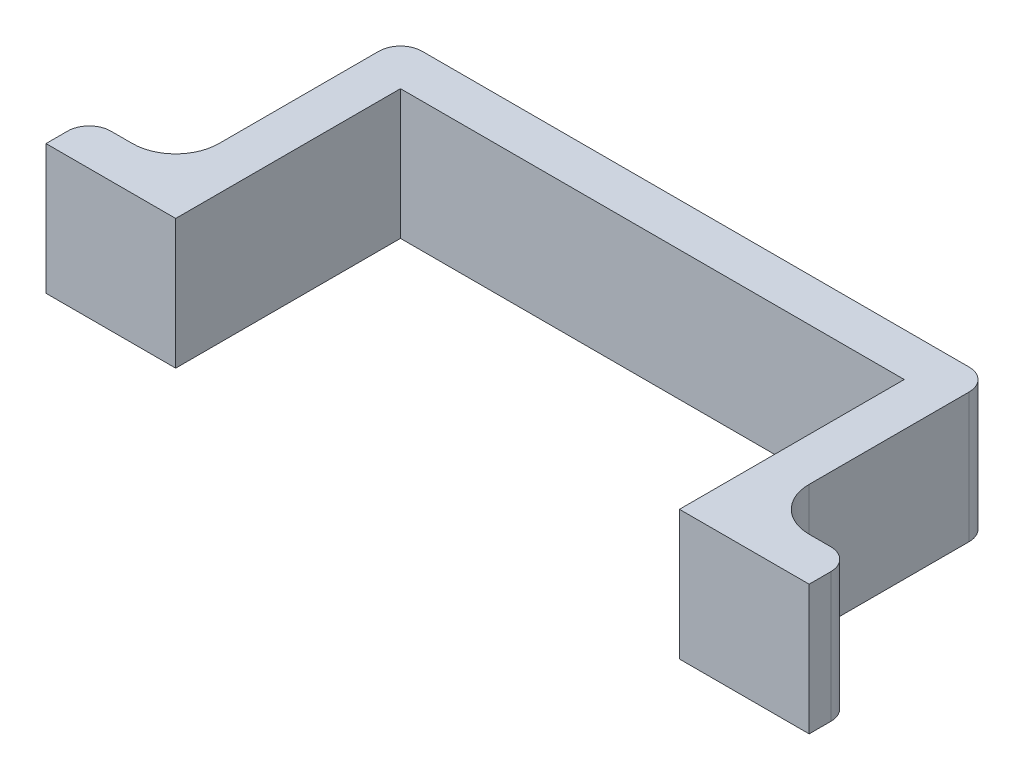
ISO-10303-21;
HEADER;
FILE_DESCRIPTION(('STEP AP214'),'2;1');
FILE_NAME('part.step','',(''),(''),'','','');
FILE_SCHEMA(('AUTOMOTIVE_DESIGN { 1 0 10303 214 1 1 1 1 }'));
ENDSEC;
DATA;
#1=APPLICATION_CONTEXT('core data for automotive mechanical design processes');
#2=APPLICATION_PROTOCOL_DEFINITION('international standard','automotive_design',2000,#1);
#3=PRODUCT_CONTEXT('',#1,'mechanical');
#4=PRODUCT('Part','Part','',(#3));
#5=PRODUCT_RELATED_PRODUCT_CATEGORY('part','',(#4));
#6=PRODUCT_DEFINITION_FORMATION('','',#4);
#7=PRODUCT_DEFINITION_CONTEXT('part definition',#1,'design');
#8=PRODUCT_DEFINITION('design','',#6,#7);
#9=PRODUCT_DEFINITION_SHAPE('','',#8);
#10=(LENGTH_UNIT() NAMED_UNIT(*) SI_UNIT(.MILLI.,.METRE.));
#11=(NAMED_UNIT(*) PLANE_ANGLE_UNIT() SI_UNIT($,.RADIAN.));
#12=(NAMED_UNIT(*) SI_UNIT($,.STERADIAN.) SOLID_ANGLE_UNIT());
#13=UNCERTAINTY_MEASURE_WITH_UNIT(LENGTH_MEASURE(1.E-05),#10,'distance_accuracy_value','');
#14=(GEOMETRIC_REPRESENTATION_CONTEXT(3) GLOBAL_UNCERTAINTY_ASSIGNED_CONTEXT((#13)) GLOBAL_UNIT_ASSIGNED_CONTEXT((#10,
#11,#12)) REPRESENTATION_CONTEXT('',''));
#15=CARTESIAN_POINT('',(0.,0.,0.));
#16=DIRECTION('',(0.,0.,1.));
#17=DIRECTION('',(1.,0.,0.));
#18=AXIS2_PLACEMENT_3D('',#15,#16,#17);
#19=CARTESIAN_POINT('',(-40.175,19.05,-3.17499999999999));
#20=DIRECTION('',(0.,-1.,0.));
#21=DIRECTION('',(0.,0.,-1.));
#22=AXIS2_PLACEMENT_3D('',#19,#20,#21);
#23=CYLINDRICAL_SURFACE('',#22,3.175);
#24=CARTESIAN_POINT('',(-40.175,0.,-3.17499999999999));
#25=DIRECTION('',(0.,1.,0.));
#26=DIRECTION('',(0.,0.,1.));
#27=AXIS2_PLACEMENT_3D('',#24,#25,#26);
#28=CIRCLE('',#27,3.175);
#29=CARTESIAN_POINT('',(-43.35,0.,-3.17499999999999));
#30=VERTEX_POINT('',#29);
#31=CARTESIAN_POINT('',(-40.175,0.,-6.35));
#32=VERTEX_POINT('',#31);
#33=EDGE_CURVE('E202',#30,#32,#28,.F.);
#34=ORIENTED_EDGE('',*,*,#33,.F.);
#35=DIRECTION('',(0.,-1.,0.));
#36=VECTOR('',#35,1.);
#37=CARTESIAN_POINT('',(-43.35,19.05,-3.17499999999999));
#38=LINE('',#37,#36);
#39=CARTESIAN_POINT('',(-43.35,19.05,-3.17499999999999));
#40=VERTEX_POINT('',#39);
#41=EDGE_CURVE('E12',#40,#30,#38,.T.);
#42=ORIENTED_EDGE('',*,*,#41,.F.);
#43=CARTESIAN_POINT('',(-40.175,19.05,-3.17499999999999));
#44=DIRECTION('',(0.,1.,0.));
#45=DIRECTION('',(0.,0.,1.));
#46=AXIS2_PLACEMENT_3D('',#43,#44,#45);
#47=CIRCLE('',#46,3.175);
#48=CARTESIAN_POINT('',(-40.175,19.05,-6.35));
#49=VERTEX_POINT('',#48);
#50=EDGE_CURVE('E265',#40,#49,#47,.F.);
#51=ORIENTED_EDGE('',*,*,#50,.T.);
#52=DIRECTION('',(0.,-1.,0.));
#53=VECTOR('',#52,1.);
#54=CARTESIAN_POINT('',(-40.175,19.05,-6.35));
#55=LINE('',#54,#53);
#56=EDGE_CURVE('E61',#49,#32,#55,.T.);
#57=ORIENTED_EDGE('',*,*,#56,.T.);
#58=EDGE_LOOP('',(#34,#42,#51,#57));
#59=FACE_BOUND('',#58,.T.);
#60=ADVANCED_FACE('F44',(#59),#23,.T.);
#61=CARTESIAN_POINT('',(-43.35,19.05,0.));
#62=DIRECTION('',(-1.,0.,0.));
#63=DIRECTION('',(0.,0.,1.));
#64=AXIS2_PLACEMENT_3D('',#61,#62,#63);
#65=PLANE('',#64);
#66=DIRECTION('',(0.,0.,-1.));
#67=VECTOR('',#66,1.);
#68=CARTESIAN_POINT('',(-43.35,0.,0.));
#69=LINE('',#68,#67);
#70=CARTESIAN_POINT('',(-43.35,0.,20.32));
#71=VERTEX_POINT('',#70);
#72=EDGE_CURVE('E205',#71,#30,#69,.T.);
#73=ORIENTED_EDGE('',*,*,#72,.F.);
#74=DIRECTION('',(0.,-1.,0.));
#75=VECTOR('',#74,1.);
#76=CARTESIAN_POINT('',(-43.35,19.05,20.32));
#77=LINE('',#76,#75);
#78=CARTESIAN_POINT('',(-43.35,19.05,20.32));
#79=VERTEX_POINT('',#78);
#80=EDGE_CURVE('E53',#79,#71,#77,.T.);
#81=ORIENTED_EDGE('',*,*,#80,.F.);
#82=DIRECTION('',(0.,0.,-1.));
#83=VECTOR('',#82,1.);
#84=CARTESIAN_POINT('',(-43.35,19.05,0.));
#85=LINE('',#84,#83);
#86=EDGE_CURVE('E328',#79,#40,#85,.T.);
#87=ORIENTED_EDGE('',*,*,#86,.T.);
#88=ORIENTED_EDGE('',*,*,#41,.T.);
#89=EDGE_LOOP('',(#73,#81,#87,#88));
#90=FACE_BOUND('',#89,.T.);
#91=ADVANCED_FACE('F327',(#90),#65,.T.);
#92=CARTESIAN_POINT('',(-49.7,19.05,20.32));
#93=DIRECTION('',(0.,-1.,0.));
#94=DIRECTION('',(0.,0.,-1.));
#95=AXIS2_PLACEMENT_3D('',#92,#93,#94);
#96=CYLINDRICAL_SURFACE('',#95,6.34999999999999);
#97=CARTESIAN_POINT('',(-49.7,0.,20.32));
#98=DIRECTION('',(0.,1.,0.));
#99=DIRECTION('',(0.,0.,1.));
#100=AXIS2_PLACEMENT_3D('',#97,#98,#99);
#101=CIRCLE('',#100,6.34999999999999);
#102=CARTESIAN_POINT('',(-49.7,0.,26.67));
#103=VERTEX_POINT('',#102);
#104=EDGE_CURVE('E209',#71,#103,#101,.F.);
#105=ORIENTED_EDGE('',*,*,#104,.T.);
#106=DIRECTION('',(0.,-1.,0.));
#107=VECTOR('',#106,1.);
#108=CARTESIAN_POINT('',(-49.7,19.05,26.67));
#109=LINE('',#108,#107);
#110=CARTESIAN_POINT('',(-49.7,19.05,26.67));
#111=VERTEX_POINT('',#110);
#112=EDGE_CURVE('E309',#111,#103,#109,.T.);
#113=ORIENTED_EDGE('',*,*,#112,.F.);
#114=CARTESIAN_POINT('',(-49.7,19.05,20.32));
#115=DIRECTION('',(0.,1.,0.));
#116=DIRECTION('',(0.,0.,1.));
#117=AXIS2_PLACEMENT_3D('',#114,#115,#116);
#118=CIRCLE('',#117,6.34999999999999);
#119=EDGE_CURVE('E318',#79,#111,#118,.F.);
#120=ORIENTED_EDGE('',*,*,#119,.F.);
#121=ORIENTED_EDGE('',*,*,#80,.T.);
#122=EDGE_LOOP('',(#105,#113,#120,#121));
#123=FACE_BOUND('',#122,.T.);
#124=ADVANCED_FACE('F316',(#123),#96,.F.);
#125=CARTESIAN_POINT('',(0.,19.05,26.67));
#126=DIRECTION('',(0.,0.,1.));
#127=DIRECTION('',(1.,0.,0.));
#128=AXIS2_PLACEMENT_3D('',#125,#126,#127);
#129=PLANE('',#128);
#130=DIRECTION('',(-1.,0.,0.));
#131=VECTOR('',#130,1.);
#132=CARTESIAN_POINT('',(0.,0.,26.67));
#133=LINE('',#132,#131);
#134=CARTESIAN_POINT('',(-52.875,0.,26.67));
#135=VERTEX_POINT('',#134);
#136=EDGE_CURVE('E212',#103,#135,#133,.T.);
#137=ORIENTED_EDGE('',*,*,#136,.T.);
#138=DIRECTION('',(0.,-1.,0.));
#139=VECTOR('',#138,1.);
#140=CARTESIAN_POINT('',(-52.875,19.05,26.67));
#141=LINE('',#140,#139);
#142=CARTESIAN_POINT('',(-52.875,19.05,26.67));
#143=VERTEX_POINT('',#142);
#144=EDGE_CURVE('E305',#143,#135,#141,.T.);
#145=ORIENTED_EDGE('',*,*,#144,.F.);
#146=DIRECTION('',(-1.,0.,0.));
#147=VECTOR('',#146,1.);
#148=CARTESIAN_POINT('',(0.,19.05,26.67));
#149=LINE('',#148,#147);
#150=EDGE_CURVE('E595',#111,#143,#149,.T.);
#151=ORIENTED_EDGE('',*,*,#150,.F.);
#152=ORIENTED_EDGE('',*,*,#112,.T.);
#153=EDGE_LOOP('',(#137,#145,#151,#152));
#154=FACE_BOUND('',#153,.T.);
#155=ADVANCED_FACE('F346',(#154),#129,.F.);
#156=CARTESIAN_POINT('',(-52.875,19.05,29.845));
#157=DIRECTION('',(0.,-1.,0.));
#158=DIRECTION('',(0.,0.,-1.));
#159=AXIS2_PLACEMENT_3D('',#156,#157,#158);
#160=CYLINDRICAL_SURFACE('',#159,3.17500000000001);
#161=CARTESIAN_POINT('',(-52.875,0.,29.845));
#162=DIRECTION('',(0.,1.,0.));
#163=DIRECTION('',(0.,0.,1.));
#164=AXIS2_PLACEMENT_3D('',#161,#162,#163);
#165=CIRCLE('',#164,3.17500000000001);
#166=CARTESIAN_POINT('',(-56.05,0.,29.845));
#167=VERTEX_POINT('',#166);
#168=EDGE_CURVE('E215',#135,#167,#165,.T.);
#169=ORIENTED_EDGE('',*,*,#168,.T.);
#170=DIRECTION('',(0.,-1.,0.));
#171=VECTOR('',#170,1.);
#172=CARTESIAN_POINT('',(-56.05,19.05,29.845));
#173=LINE('',#172,#171);
#174=CARTESIAN_POINT('',(-56.05,19.05,29.845));
#175=VERTEX_POINT('',#174);
#176=EDGE_CURVE('E302',#175,#167,#173,.T.);
#177=ORIENTED_EDGE('',*,*,#176,.F.);
#178=CARTESIAN_POINT('',(-52.875,19.05,29.845));
#179=DIRECTION('',(0.,1.,0.));
#180=DIRECTION('',(0.,0.,1.));
#181=AXIS2_PLACEMENT_3D('',#178,#179,#180);
#182=CIRCLE('',#181,3.17500000000001);
#183=EDGE_CURVE('E593',#143,#175,#182,.T.);
#184=ORIENTED_EDGE('',*,*,#183,.F.);
#185=ORIENTED_EDGE('',*,*,#144,.T.);
#186=EDGE_LOOP('',(#169,#177,#184,#185));
#187=FACE_BOUND('',#186,.T.);
#188=ADVANCED_FACE('F351',(#187),#160,.T.);
#189=CARTESIAN_POINT('',(-56.0500000000001,19.05,2.44992128071812E-13));
#190=DIRECTION('',(-1.,0.,0.));
#191=DIRECTION('',(0.,0.,1.));
#192=AXIS2_PLACEMENT_3D('',#189,#190,#191);
#193=PLANE('',#192);
#194=DIRECTION('',(0.,0.,-1.));
#195=VECTOR('',#194,1.);
#196=CARTESIAN_POINT('',(-56.0500000000001,0.,2.44992128071812E-13));
#197=LINE('',#196,#195);
#198=CARTESIAN_POINT('',(-56.05,0.,33.02));
#199=VERTEX_POINT('',#198);
#200=EDGE_CURVE('E219',#199,#167,#197,.T.);
#201=ORIENTED_EDGE('',*,*,#200,.F.);
#202=DIRECTION('',(0.,-1.,0.));
#203=VECTOR('',#202,1.);
#204=CARTESIAN_POINT('',(-56.05,19.05,33.02));
#205=LINE('',#204,#203);
#206=CARTESIAN_POINT('',(-56.05,19.05,33.02));
#207=VERTEX_POINT('',#206);
#208=EDGE_CURVE('E299',#207,#199,#205,.T.);
#209=ORIENTED_EDGE('',*,*,#208,.F.);
#210=DIRECTION('',(0.,0.,-1.));
#211=VECTOR('',#210,1.);
#212=CARTESIAN_POINT('',(-56.0500000000001,19.05,2.44992128071812E-13));
#213=LINE('',#212,#211);
#214=EDGE_CURVE('E590',#207,#175,#213,.T.);
#215=ORIENTED_EDGE('',*,*,#214,.T.);
#216=ORIENTED_EDGE('',*,*,#176,.T.);
#217=EDGE_LOOP('',(#201,#209,#215,#216));
#218=FACE_BOUND('',#217,.T.);
#219=ADVANCED_FACE('F355',(#218),#193,.T.);
#220=CARTESIAN_POINT('',(0.,19.05,33.02));
#221=DIRECTION('',(0.,0.,1.));
#222=DIRECTION('',(1.,0.,0.));
#223=AXIS2_PLACEMENT_3D('',#220,#221,#222);
#224=PLANE('',#223);
#225=DIRECTION('',(-1.,0.,0.));
#226=VECTOR('',#225,1.);
#227=CARTESIAN_POINT('',(0.,0.,33.02));
#228=LINE('',#227,#226);
#229=CARTESIAN_POINT('',(-37.,0.,33.02));
#230=VERTEX_POINT('',#229);
#231=EDGE_CURVE('E223',#230,#199,#228,.T.);
#232=ORIENTED_EDGE('',*,*,#231,.F.);
#233=DIRECTION('',(0.,-1.,0.));
#234=VECTOR('',#233,1.);
#235=CARTESIAN_POINT('',(-37.,19.05,33.02));
#236=LINE('',#235,#234);
#237=CARTESIAN_POINT('',(-37.,19.05,33.02));
#238=VERTEX_POINT('',#237);
#239=EDGE_CURVE('E296',#238,#230,#236,.T.);
#240=ORIENTED_EDGE('',*,*,#239,.F.);
#241=DIRECTION('',(-1.,0.,0.));
#242=VECTOR('',#241,1.);
#243=CARTESIAN_POINT('',(0.,19.05,33.02));
#244=LINE('',#243,#242);
#245=EDGE_CURVE('E606',#238,#207,#244,.T.);
#246=ORIENTED_EDGE('',*,*,#245,.T.);
#247=ORIENTED_EDGE('',*,*,#208,.T.);
#248=EDGE_LOOP('',(#232,#240,#246,#247));
#249=FACE_BOUND('',#248,.T.);
#250=ADVANCED_FACE('F359',(#249),#224,.T.);
#251=CARTESIAN_POINT('',(-37.,19.05,0.));
#252=DIRECTION('',(1.,0.,0.));
#253=DIRECTION('',(0.,0.,-1.));
#254=AXIS2_PLACEMENT_3D('',#251,#252,#253);
#255=PLANE('',#254);
#256=DIRECTION('',(0.,0.,1.));
#257=VECTOR('',#256,1.);
#258=CARTESIAN_POINT('',(-37.,0.,0.));
#259=LINE('',#258,#257);
#260=CARTESIAN_POINT('',(-37.,0.,0.));
#261=VERTEX_POINT('',#260);
#262=EDGE_CURVE('E227',#261,#230,#259,.T.);
#263=ORIENTED_EDGE('',*,*,#262,.F.);
#264=DIRECTION('',(0.,-1.,0.));
#265=VECTOR('',#264,1.);
#266=CARTESIAN_POINT('',(-37.,19.05,0.));
#267=LINE('',#266,#265);
#268=CARTESIAN_POINT('',(-37.,19.05,0.));
#269=VERTEX_POINT('',#268);
#270=EDGE_CURVE('E293',#269,#261,#267,.T.);
#271=ORIENTED_EDGE('',*,*,#270,.F.);
#272=DIRECTION('',(0.,0.,1.));
#273=VECTOR('',#272,1.);
#274=CARTESIAN_POINT('',(-37.,19.05,0.));
#275=LINE('',#274,#273);
#276=EDGE_CURVE('E583',#269,#238,#275,.T.);
#277=ORIENTED_EDGE('',*,*,#276,.T.);
#278=ORIENTED_EDGE('',*,*,#239,.T.);
#279=EDGE_LOOP('',(#263,#271,#277,#278));
#280=FACE_BOUND('',#279,.T.);
#281=ADVANCED_FACE('F363',(#280),#255,.T.);
#282=CARTESIAN_POINT('',(0.,19.05,0.));
#283=DIRECTION('',(0.,0.,-1.));
#284=DIRECTION('',(-1.,0.,0.));
#285=AXIS2_PLACEMENT_3D('',#282,#283,#284);
#286=PLANE('',#285);
#287=DIRECTION('',(1.,0.,0.));
#288=VECTOR('',#287,1.);
#289=CARTESIAN_POINT('',(0.,0.,0.));
#290=LINE('',#289,#288);
#291=CARTESIAN_POINT('',(37.,0.,0.));
#292=VERTEX_POINT('',#291);
#293=EDGE_CURVE('E231',#261,#292,#290,.T.);
#294=ORIENTED_EDGE('',*,*,#293,.T.);
#295=DIRECTION('',(0.,-1.,0.));
#296=VECTOR('',#295,1.);
#297=CARTESIAN_POINT('',(37.,19.05,0.));
#298=LINE('',#297,#296);
#299=CARTESIAN_POINT('',(37.,19.05,0.));
#300=VERTEX_POINT('',#299);
#301=EDGE_CURVE('E289',#300,#292,#298,.T.);
#302=ORIENTED_EDGE('',*,*,#301,.F.);
#303=DIRECTION('',(1.,0.,0.));
#304=VECTOR('',#303,1.);
#305=CARTESIAN_POINT('',(0.,19.05,0.));
#306=LINE('',#305,#304);
#307=EDGE_CURVE('E578',#269,#300,#306,.T.);
#308=ORIENTED_EDGE('',*,*,#307,.F.);
#309=ORIENTED_EDGE('',*,*,#270,.T.);
#310=EDGE_LOOP('',(#294,#302,#308,#309));
#311=FACE_BOUND('',#310,.T.);
#312=ADVANCED_FACE('F367',(#311),#286,.F.);
#313=CARTESIAN_POINT('',(37.,19.05,0.));
#314=DIRECTION('',(1.,0.,0.));
#315=DIRECTION('',(0.,0.,-1.));
#316=AXIS2_PLACEMENT_3D('',#313,#314,#315);
#317=PLANE('',#316);
#318=DIRECTION('',(0.,0.,1.));
#319=VECTOR('',#318,1.);
#320=CARTESIAN_POINT('',(37.,0.,0.));
#321=LINE('',#320,#319);
#322=CARTESIAN_POINT('',(37.,0.,33.02));
#323=VERTEX_POINT('',#322);
#324=EDGE_CURVE('E234',#292,#323,#321,.T.);
#325=ORIENTED_EDGE('',*,*,#324,.T.);
#326=DIRECTION('',(0.,-1.,0.));
#327=VECTOR('',#326,1.);
#328=CARTESIAN_POINT('',(37.,19.05,33.02));
#329=LINE('',#328,#327);
#330=CARTESIAN_POINT('',(37.,19.05,33.02));
#331=VERTEX_POINT('',#330);
#332=EDGE_CURVE('E285',#331,#323,#329,.T.);
#333=ORIENTED_EDGE('',*,*,#332,.F.);
#334=DIRECTION('',(0.,0.,1.));
#335=VECTOR('',#334,1.);
#336=CARTESIAN_POINT('',(37.,19.05,0.));
#337=LINE('',#336,#335);
#338=EDGE_CURVE('E575',#300,#331,#337,.T.);
#339=ORIENTED_EDGE('',*,*,#338,.F.);
#340=ORIENTED_EDGE('',*,*,#301,.T.);
#341=EDGE_LOOP('',(#325,#333,#339,#340));
#342=FACE_BOUND('',#341,.T.);
#343=ADVANCED_FACE('F371',(#342),#317,.F.);
#344=CARTESIAN_POINT('',(0.,19.05,33.02));
#345=DIRECTION('',(0.,0.,-1.));
#346=DIRECTION('',(-1.,0.,0.));
#347=AXIS2_PLACEMENT_3D('',#344,#345,#346);
#348=PLANE('',#347);
#349=DIRECTION('',(1.,0.,0.));
#350=VECTOR('',#349,1.);
#351=CARTESIAN_POINT('',(0.,0.,33.02));
#352=LINE('',#351,#350);
#353=CARTESIAN_POINT('',(56.05,0.,33.02));
#354=VERTEX_POINT('',#353);
#355=EDGE_CURVE('E237',#323,#354,#352,.T.);
#356=ORIENTED_EDGE('',*,*,#355,.T.);
#357=DIRECTION('',(0.,-1.,0.));
#358=VECTOR('',#357,1.);
#359=CARTESIAN_POINT('',(56.05,19.05,33.02));
#360=LINE('',#359,#358);
#361=CARTESIAN_POINT('',(56.05,19.05,33.02));
#362=VERTEX_POINT('',#361);
#363=EDGE_CURVE('E281',#362,#354,#360,.T.);
#364=ORIENTED_EDGE('',*,*,#363,.F.);
#365=DIRECTION('',(1.,0.,0.));
#366=VECTOR('',#365,1.);
#367=CARTESIAN_POINT('',(0.,19.05,33.02));
#368=LINE('',#367,#366);
#369=EDGE_CURVE('E573',#331,#362,#368,.T.);
#370=ORIENTED_EDGE('',*,*,#369,.F.);
#371=ORIENTED_EDGE('',*,*,#332,.T.);
#372=EDGE_LOOP('',(#356,#364,#370,#371));
#373=FACE_BOUND('',#372,.T.);
#374=ADVANCED_FACE('F375',(#373),#348,.F.);
#375=CARTESIAN_POINT('',(56.0500000000001,19.05,2.44992128071812E-13));
#376=DIRECTION('',(-1.,0.,0.));
#377=DIRECTION('',(0.,0.,1.));
#378=AXIS2_PLACEMENT_3D('',#375,#376,#377);
#379=PLANE('',#378);
#380=DIRECTION('',(0.,0.,-1.));
#381=VECTOR('',#380,1.);
#382=CARTESIAN_POINT('',(56.0500000000001,0.,2.44992128071812E-13));
#383=LINE('',#382,#381);
#384=CARTESIAN_POINT('',(56.05,0.,29.845));
#385=VERTEX_POINT('',#384);
#386=EDGE_CURVE('E240',#354,#385,#383,.T.);
#387=ORIENTED_EDGE('',*,*,#386,.T.);
#388=DIRECTION('',(0.,-1.,0.));
#389=VECTOR('',#388,1.);
#390=CARTESIAN_POINT('',(56.05,19.05,29.845));
#391=LINE('',#390,#389);
#392=CARTESIAN_POINT('',(56.05,19.05,29.845));
#393=VERTEX_POINT('',#392);
#394=EDGE_CURVE('E278',#393,#385,#391,.T.);
#395=ORIENTED_EDGE('',*,*,#394,.F.);
#396=DIRECTION('',(0.,0.,-1.));
#397=VECTOR('',#396,1.);
#398=CARTESIAN_POINT('',(56.0500000000001,19.05,2.44992128071812E-13));
#399=LINE('',#398,#397);
#400=EDGE_CURVE('E617',#362,#393,#399,.T.);
#401=ORIENTED_EDGE('',*,*,#400,.F.);
#402=ORIENTED_EDGE('',*,*,#363,.T.);
#403=EDGE_LOOP('',(#387,#395,#401,#402));
#404=FACE_BOUND('',#403,.T.);
#405=ADVANCED_FACE('F379',(#404),#379,.F.);
#406=CARTESIAN_POINT('',(52.875,19.05,29.845));
#407=DIRECTION('',(0.,-1.,0.));
#408=DIRECTION('',(0.,0.,-1.));
#409=AXIS2_PLACEMENT_3D('',#406,#407,#408);
#410=CYLINDRICAL_SURFACE('',#409,3.17500000000001);
#411=CARTESIAN_POINT('',(52.875,0.,29.845));
#412=DIRECTION('',(0.,1.,0.));
#413=DIRECTION('',(0.,0.,1.));
#414=AXIS2_PLACEMENT_3D('',#411,#412,#413);
#415=CIRCLE('',#414,3.17500000000001);
#416=CARTESIAN_POINT('',(52.875,0.,26.67));
#417=VERTEX_POINT('',#416);
#418=EDGE_CURVE('E244',#417,#385,#415,.F.);
#419=ORIENTED_EDGE('',*,*,#418,.F.);
#420=DIRECTION('',(0.,-1.,0.));
#421=VECTOR('',#420,1.);
#422=CARTESIAN_POINT('',(52.875,19.05,26.67));
#423=LINE('',#422,#421);
#424=CARTESIAN_POINT('',(52.875,19.05,26.67));
#425=VERTEX_POINT('',#424);
#426=EDGE_CURVE('E275',#425,#417,#423,.T.);
#427=ORIENTED_EDGE('',*,*,#426,.F.);
#428=CARTESIAN_POINT('',(52.875,19.05,29.845));
#429=DIRECTION('',(0.,1.,0.));
#430=DIRECTION('',(0.,0.,1.));
#431=AXIS2_PLACEMENT_3D('',#428,#429,#430);
#432=CIRCLE('',#431,3.17500000000001);
#433=EDGE_CURVE('E565',#425,#393,#432,.F.);
#434=ORIENTED_EDGE('',*,*,#433,.T.);
#435=ORIENTED_EDGE('',*,*,#394,.T.);
#436=EDGE_LOOP('',(#419,#427,#434,#435));
#437=FACE_BOUND('',#436,.T.);
#438=ADVANCED_FACE('F383',(#437),#410,.T.);
#439=CARTESIAN_POINT('',(0.,19.05,26.67));
#440=DIRECTION('',(0.,0.,-1.));
#441=DIRECTION('',(-1.,0.,0.));
#442=AXIS2_PLACEMENT_3D('',#439,#440,#441);
#443=PLANE('',#442);
#444=DIRECTION('',(1.,0.,0.));
#445=VECTOR('',#444,1.);
#446=CARTESIAN_POINT('',(0.,0.,26.67));
#447=LINE('',#446,#445);
#448=CARTESIAN_POINT('',(49.7,0.,26.67));
#449=VERTEX_POINT('',#448);
#450=EDGE_CURVE('E248',#449,#417,#447,.T.);
#451=ORIENTED_EDGE('',*,*,#450,.F.);
#452=DIRECTION('',(0.,-1.,0.));
#453=VECTOR('',#452,1.);
#454=CARTESIAN_POINT('',(49.7,19.05,26.67));
#455=LINE('',#454,#453);
#456=CARTESIAN_POINT('',(49.7,19.05,26.67));
#457=VERTEX_POINT('',#456);
#458=EDGE_CURVE('E272',#457,#449,#455,.T.);
#459=ORIENTED_EDGE('',*,*,#458,.F.);
#460=DIRECTION('',(1.,0.,0.));
#461=VECTOR('',#460,1.);
#462=CARTESIAN_POINT('',(0.,19.05,26.67));
#463=LINE('',#462,#461);
#464=EDGE_CURVE('E561',#457,#425,#463,.T.);
#465=ORIENTED_EDGE('',*,*,#464,.T.);
#466=ORIENTED_EDGE('',*,*,#426,.T.);
#467=EDGE_LOOP('',(#451,#459,#465,#466));
#468=FACE_BOUND('',#467,.T.);
#469=ADVANCED_FACE('F387',(#468),#443,.T.);
#470=CARTESIAN_POINT('',(49.7,19.05,20.32));
#471=DIRECTION('',(0.,-1.,0.));
#472=DIRECTION('',(0.,0.,-1.));
#473=AXIS2_PLACEMENT_3D('',#470,#471,#472);
#474=CYLINDRICAL_SURFACE('',#473,6.34999999999999);
#475=CARTESIAN_POINT('',(49.7,0.,20.32));
#476=DIRECTION('',(0.,1.,0.));
#477=DIRECTION('',(0.,0.,1.));
#478=AXIS2_PLACEMENT_3D('',#475,#476,#477);
#479=CIRCLE('',#478,6.34999999999999);
#480=CARTESIAN_POINT('',(43.35,0.,20.32));
#481=VERTEX_POINT('',#480);
#482=EDGE_CURVE('E252',#481,#449,#479,.T.);
#483=ORIENTED_EDGE('',*,*,#482,.F.);
#484=DIRECTION('',(0.,-1.,0.));
#485=VECTOR('',#484,1.);
#486=CARTESIAN_POINT('',(43.35,19.05,20.32));
#487=LINE('',#486,#485);
#488=CARTESIAN_POINT('',(43.35,19.05,20.32));
#489=VERTEX_POINT('',#488);
#490=EDGE_CURVE('E181',#489,#481,#487,.T.);
#491=ORIENTED_EDGE('',*,*,#490,.F.);
#492=CARTESIAN_POINT('',(49.7,19.05,20.32));
#493=DIRECTION('',(0.,1.,0.));
#494=DIRECTION('',(0.,0.,1.));
#495=AXIS2_PLACEMENT_3D('',#492,#493,#494);
#496=CIRCLE('',#495,6.34999999999999);
#497=EDGE_CURVE('E191',#489,#457,#496,.T.);
#498=ORIENTED_EDGE('',*,*,#497,.T.);
#499=ORIENTED_EDGE('',*,*,#458,.T.);
#500=EDGE_LOOP('',(#483,#491,#498,#499));
#501=FACE_BOUND('',#500,.T.);
#502=ADVANCED_FACE('F391',(#501),#474,.F.);
#503=CARTESIAN_POINT('',(43.35,19.05,0.));
#504=DIRECTION('',(1.,0.,0.));
#505=DIRECTION('',(0.,0.,-1.));
#506=AXIS2_PLACEMENT_3D('',#503,#504,#505);
#507=PLANE('',#506);
#508=DIRECTION('',(0.,0.,1.));
#509=VECTOR('',#508,1.);
#510=CARTESIAN_POINT('',(43.35,0.,0.));
#511=LINE('',#510,#509);
#512=CARTESIAN_POINT('',(43.35,0.,-3.175));
#513=VERTEX_POINT('',#512);
#514=EDGE_CURVE('E176',#513,#481,#511,.T.);
#515=ORIENTED_EDGE('',*,*,#514,.F.);
#516=DIRECTION('',(0.,-1.,0.));
#517=VECTOR('',#516,1.);
#518=CARTESIAN_POINT('',(43.35,19.05,-3.175));
#519=LINE('',#518,#517);
#520=CARTESIAN_POINT('',(43.35,19.05,-3.175));
#521=VERTEX_POINT('',#520);
#522=EDGE_CURVE('E171',#521,#513,#519,.T.);
#523=ORIENTED_EDGE('',*,*,#522,.F.);
#524=DIRECTION('',(0.,0.,1.));
#525=VECTOR('',#524,1.);
#526=CARTESIAN_POINT('',(43.35,19.05,0.));
#527=LINE('',#526,#525);
#528=EDGE_CURVE('E174',#521,#489,#527,.T.);
#529=ORIENTED_EDGE('',*,*,#528,.T.);
#530=ORIENTED_EDGE('',*,*,#490,.T.);
#531=EDGE_LOOP('',(#515,#523,#529,#530));
#532=FACE_BOUND('',#531,.T.);
#533=ADVANCED_FACE('F173',(#532),#507,.T.);
#534=CARTESIAN_POINT('',(40.175,19.05,-3.175));
#535=DIRECTION('',(0.,-1.,0.));
#536=DIRECTION('',(0.,0.,-1.));
#537=AXIS2_PLACEMENT_3D('',#534,#535,#536);
#538=CYLINDRICAL_SURFACE('',#537,3.175);
#539=CARTESIAN_POINT('',(40.175,0.,-3.175));
#540=DIRECTION('',(0.,1.,0.));
#541=DIRECTION('',(0.,0.,1.));
#542=AXIS2_PLACEMENT_3D('',#539,#540,#541);
#543=CIRCLE('',#542,3.175);
#544=CARTESIAN_POINT('',(40.175,0.,-6.35000000000001));
#545=VERTEX_POINT('',#544);
#546=EDGE_CURVE('E258',#545,#513,#543,.F.);
#547=ORIENTED_EDGE('',*,*,#546,.F.);
#548=DIRECTION('',(0.,-1.,0.));
#549=VECTOR('',#548,1.);
#550=CARTESIAN_POINT('',(40.175,19.05,-6.35000000000001));
#551=LINE('',#550,#549);
#552=CARTESIAN_POINT('',(40.175,19.05,-6.35000000000001));
#553=VERTEX_POINT('',#552);
#554=EDGE_CURVE('E116',#553,#545,#551,.T.);
#555=ORIENTED_EDGE('',*,*,#554,.F.);
#556=CARTESIAN_POINT('',(40.175,19.05,-3.175));
#557=DIRECTION('',(0.,1.,0.));
#558=DIRECTION('',(0.,0.,1.));
#559=AXIS2_PLACEMENT_3D('',#556,#557,#558);
#560=CIRCLE('',#559,3.175);
#561=EDGE_CURVE('E188',#553,#521,#560,.F.);
#562=ORIENTED_EDGE('',*,*,#561,.T.);
#563=ORIENTED_EDGE('',*,*,#522,.T.);
#564=EDGE_LOOP('',(#547,#555,#562,#563));
#565=FACE_BOUND('',#564,.T.);
#566=ADVANCED_FACE('F194',(#565),#538,.T.);
#567=CARTESIAN_POINT('',(0.,19.05,-6.35));
#568=DIRECTION('',(0.,0.,-1.));
#569=DIRECTION('',(-1.,0.,0.));
#570=AXIS2_PLACEMENT_3D('',#567,#568,#569);
#571=PLANE('',#570);
#572=DIRECTION('',(1.,0.,0.));
#573=VECTOR('',#572,1.);
#574=CARTESIAN_POINT('',(0.,0.,-6.35));
#575=LINE('',#574,#573);
#576=EDGE_CURVE('E261',#32,#545,#575,.T.);
#577=ORIENTED_EDGE('',*,*,#576,.F.);
#578=ORIENTED_EDGE('',*,*,#56,.F.);
#579=DIRECTION('',(1.,0.,0.));
#580=VECTOR('',#579,1.);
#581=CARTESIAN_POINT('',(0.,19.05,-6.35));
#582=LINE('',#581,#580);
#583=EDGE_CURVE('E196',#49,#553,#582,.T.);
#584=ORIENTED_EDGE('',*,*,#583,.T.);
#585=ORIENTED_EDGE('',*,*,#554,.T.);
#586=EDGE_LOOP('',(#577,#578,#584,#585));
#587=FACE_BOUND('',#586,.T.);
#588=ADVANCED_FACE('F329',(#587),#571,.T.);
#589=CARTESIAN_POINT('',(0.,19.05,0.));
#590=DIRECTION('',(0.,1.,0.));
#591=DIRECTION('',(0.,0.,1.));
#592=AXIS2_PLACEMENT_3D('',#589,#590,#591);
#593=PLANE('',#592);
#594=ORIENTED_EDGE('',*,*,#50,.F.);
#595=ORIENTED_EDGE('',*,*,#86,.F.);
#596=ORIENTED_EDGE('',*,*,#119,.T.);
#597=ORIENTED_EDGE('',*,*,#150,.T.);
#598=ORIENTED_EDGE('',*,*,#183,.T.);
#599=ORIENTED_EDGE('',*,*,#214,.F.);
#600=ORIENTED_EDGE('',*,*,#245,.F.);
#601=ORIENTED_EDGE('',*,*,#276,.F.);
#602=ORIENTED_EDGE('',*,*,#307,.T.);
#603=ORIENTED_EDGE('',*,*,#338,.T.);
#604=ORIENTED_EDGE('',*,*,#369,.T.);
#605=ORIENTED_EDGE('',*,*,#400,.T.);
#606=ORIENTED_EDGE('',*,*,#433,.F.);
#607=ORIENTED_EDGE('',*,*,#464,.F.);
#608=ORIENTED_EDGE('',*,*,#497,.F.);
#609=ORIENTED_EDGE('',*,*,#528,.F.);
#610=ORIENTED_EDGE('',*,*,#561,.F.);
#611=ORIENTED_EDGE('',*,*,#583,.F.);
#612=EDGE_LOOP('',(#594,#595,#596,#597,#598,#599,#600,#601,#602,#603,#604,#605,#606,#607,#608,
#609,#610,#611));
#613=FACE_BOUND('',#612,.T.);
#614=ADVANCED_FACE('F186',(#613),#593,.T.);
#615=CARTESIAN_POINT('',(0.,0.,0.));
#616=DIRECTION('',(0.,1.,0.));
#617=DIRECTION('',(0.,0.,1.));
#618=AXIS2_PLACEMENT_3D('',#615,#616,#617);
#619=PLANE('',#618);
#620=ORIENTED_EDGE('',*,*,#33,.T.);
#621=ORIENTED_EDGE('',*,*,#576,.T.);
#622=ORIENTED_EDGE('',*,*,#546,.T.);
#623=ORIENTED_EDGE('',*,*,#514,.T.);
#624=ORIENTED_EDGE('',*,*,#482,.T.);
#625=ORIENTED_EDGE('',*,*,#450,.T.);
#626=ORIENTED_EDGE('',*,*,#418,.T.);
#627=ORIENTED_EDGE('',*,*,#386,.F.);
#628=ORIENTED_EDGE('',*,*,#355,.F.);
#629=ORIENTED_EDGE('',*,*,#324,.F.);
#630=ORIENTED_EDGE('',*,*,#293,.F.);
#631=ORIENTED_EDGE('',*,*,#262,.T.);
#632=ORIENTED_EDGE('',*,*,#231,.T.);
#633=ORIENTED_EDGE('',*,*,#200,.T.);
#634=ORIENTED_EDGE('',*,*,#168,.F.);
#635=ORIENTED_EDGE('',*,*,#136,.F.);
#636=ORIENTED_EDGE('',*,*,#104,.F.);
#637=ORIENTED_EDGE('',*,*,#72,.T.);
#638=EDGE_LOOP('',(#620,#621,#622,#623,#624,#625,#626,#627,#628,#629,#630,#631,#632,#633,#634,
#635,#636,#637));
#639=FACE_BOUND('',#638,.T.);
#640=ADVANCED_FACE('F325',(#639),#619,.F.);
#641=CLOSED_SHELL('',(#60,#91,#124,#155,#188,#219,#250,#281,#312,#343,#374,#405,#438,#469,#502,
#533,#566,#588,#614,#640));
#642=MANIFOLD_SOLID_BREP('B2',#641);
#643=ADVANCED_BREP_SHAPE_REPRESENTATION('',(#18,#642),#14);
#644=SHAPE_DEFINITION_REPRESENTATION(#9,#643);
ENDSEC;
END-ISO-10303-21;
